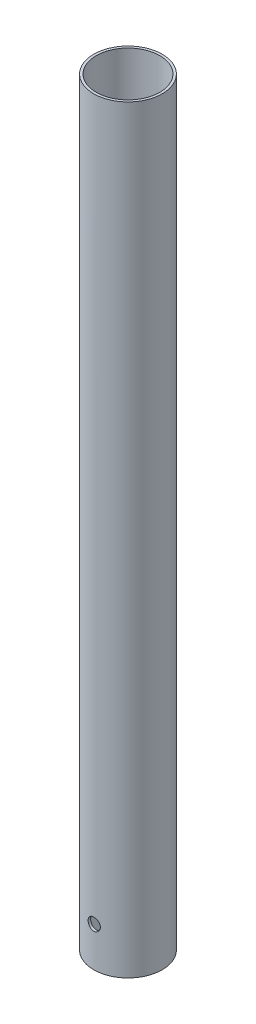
ISO-10303-21;
HEADER;
FILE_DESCRIPTION(('STEP AP214'),'2;1');
FILE_NAME('part.step','',(''),(''),'','','');
FILE_SCHEMA(('AUTOMOTIVE_DESIGN { 1 0 10303 214 1 1 1 1 }'));
ENDSEC;
DATA;
#1=APPLICATION_CONTEXT('core data for automotive mechanical design processes');
#2=APPLICATION_PROTOCOL_DEFINITION('international standard','automotive_design',2000,#1);
#3=PRODUCT_CONTEXT('',#1,'mechanical');
#4=PRODUCT('Part','Part','',(#3));
#5=PRODUCT_RELATED_PRODUCT_CATEGORY('part','',(#4));
#6=PRODUCT_DEFINITION_FORMATION('','',#4);
#7=PRODUCT_DEFINITION_CONTEXT('part definition',#1,'design');
#8=PRODUCT_DEFINITION('design','',#6,#7);
#9=PRODUCT_DEFINITION_SHAPE('','',#8);
#10=(LENGTH_UNIT() NAMED_UNIT(*) SI_UNIT(.MILLI.,.METRE.));
#11=(NAMED_UNIT(*) PLANE_ANGLE_UNIT() SI_UNIT($,.RADIAN.));
#12=(NAMED_UNIT(*) SI_UNIT($,.STERADIAN.) SOLID_ANGLE_UNIT());
#13=UNCERTAINTY_MEASURE_WITH_UNIT(LENGTH_MEASURE(1.E-05),#10,'distance_accuracy_value','');
#14=(GEOMETRIC_REPRESENTATION_CONTEXT(3) GLOBAL_UNCERTAINTY_ASSIGNED_CONTEXT((#13)) GLOBAL_UNIT_ASSIGNED_CONTEXT((#10,
#11,#12)) REPRESENTATION_CONTEXT('',''));
#15=CARTESIAN_POINT('',(0.,0.,0.));
#16=DIRECTION('',(0.,0.,1.));
#17=DIRECTION('',(1.,0.,0.));
#18=AXIS2_PLACEMENT_3D('',#15,#16,#17);
#19=CARTESIAN_POINT('',(0.,310.,0.));
#20=DIRECTION('',(0.,1.,0.));
#21=DIRECTION('',(0.,0.,1.));
#22=AXIS2_PLACEMENT_3D('',#19,#20,#21);
#23=PLANE('',#22);
#24=CARTESIAN_POINT('',(0.,310.,0.));
#25=DIRECTION('',(0.,1.,0.));
#26=DIRECTION('',(0.,0.,1.));
#27=AXIS2_PLACEMENT_3D('',#24,#25,#26);
#28=CIRCLE('',#27,14.);
#29=CARTESIAN_POINT('',(0.,310.,14.));
#30=VERTEX_POINT('',#29);
#31=EDGE_CURVE('E10',#30,#30,#28,.T.);
#32=ORIENTED_EDGE('',*,*,#31,.T.);
#33=EDGE_LOOP('',(#32));
#34=FACE_BOUND('',#33,.T.);
#35=CARTESIAN_POINT('',(0.,310.,0.));
#36=DIRECTION('',(0.,1.,0.));
#37=DIRECTION('',(0.,0.,1.));
#38=AXIS2_PLACEMENT_3D('',#35,#36,#37);
#39=CIRCLE('',#38,13.);
#40=CARTESIAN_POINT('',(0.,310.,13.));
#41=VERTEX_POINT('',#40);
#42=EDGE_CURVE('E51',#41,#41,#39,.T.);
#43=ORIENTED_EDGE('',*,*,#42,.F.);
#44=EDGE_LOOP('',(#43));
#45=FACE_BOUND('',#44,.T.);
#46=ADVANCED_FACE('F32',(#34,#45),#23,.T.);
#47=CARTESIAN_POINT('',(0.,0.,0.));
#48=DIRECTION('',(0.,1.,0.));
#49=DIRECTION('',(0.,0.,1.));
#50=AXIS2_PLACEMENT_3D('',#47,#48,#49);
#51=PLANE('',#50);
#52=CARTESIAN_POINT('',(0.,0.,0.));
#53=DIRECTION('',(0.,1.,0.));
#54=DIRECTION('',(0.,0.,1.));
#55=AXIS2_PLACEMENT_3D('',#52,#53,#54);
#56=CIRCLE('',#55,14.);
#57=CARTESIAN_POINT('',(0.,0.,14.));
#58=VERTEX_POINT('',#57);
#59=EDGE_CURVE('E46',#58,#58,#56,.T.);
#60=ORIENTED_EDGE('',*,*,#59,.F.);
#61=EDGE_LOOP('',(#60));
#62=FACE_BOUND('',#61,.T.);
#63=CARTESIAN_POINT('',(0.,0.,0.));
#64=DIRECTION('',(0.,1.,0.));
#65=DIRECTION('',(0.,0.,1.));
#66=AXIS2_PLACEMENT_3D('',#63,#64,#65);
#67=CIRCLE('',#66,13.);
#68=CARTESIAN_POINT('',(0.,0.,13.));
#69=VERTEX_POINT('',#68);
#70=EDGE_CURVE('E54',#69,#69,#67,.T.);
#71=ORIENTED_EDGE('',*,*,#70,.T.);
#72=EDGE_LOOP('',(#71));
#73=FACE_BOUND('',#72,.T.);
#74=ADVANCED_FACE('F90',(#62,#73),#51,.F.);
#75=CARTESIAN_POINT('',(0.,310.,0.));
#76=DIRECTION('',(0.,-1.,0.));
#77=DIRECTION('',(0.,0.,-1.));
#78=AXIS2_PLACEMENT_3D('',#75,#76,#77);
#79=CYLINDRICAL_SURFACE('',#78,14.);
#80=CARTESIAN_POINT('',(0.,18.67,-14.));
#81=CARTESIAN_POINT('',(-0.139239584884691,18.6699945573979,-13.9999975279519));
#82=CARTESIAN_POINT('',(-0.278551398798766,18.6583280975497,-13.9979012185717));
#83=CARTESIAN_POINT('',(-0.553257461551448,18.6119958336177,-13.9897405917584));
#84=CARTESIAN_POINT('',(-0.688648164109866,18.5773098491621,-13.9836727927304));
#85=CARTESIAN_POINT('',(-0.951498716003346,18.486027766762,-13.9682487550673));
#86=CARTESIAN_POINT('',(-1.07896532023462,18.4294506356316,-13.9588953637627));
#87=CARTESIAN_POINT('',(-1.32258294398845,18.2960443117829,-13.9379246329878));
#88=CARTESIAN_POINT('',(-1.43873504418376,18.2192170558005,-13.9263075100501));
#89=CARTESIAN_POINT('',(-1.65770744324836,18.0466007869825,-13.9019523246795));
#90=CARTESIAN_POINT('',(-1.76038642030699,17.9506338701291,-13.8892044205267));
#91=CARTESIAN_POINT('',(-1.94827611327337,17.7428452504625,-13.8640984861177));
#92=CARTESIAN_POINT('',(-2.03348564380398,17.6310224726311,-13.851740482366));
#93=CARTESIAN_POINT('',(-2.18459604528548,17.3937098828865,-13.828718102426));
#94=CARTESIAN_POINT('',(-2.2503549193704,17.268128313076,-13.8180664295287));
#95=CARTESIAN_POINT('',(-2.35978878168925,17.0074788413355,-13.799800524336));
#96=CARTESIAN_POINT('',(-2.40346549014524,16.8724116792762,-13.7921860554493));
#97=CARTESIAN_POINT('',(-2.46704527057167,16.5981311785851,-13.7809553111512));
#98=CARTESIAN_POINT('',(-2.48719373563911,16.4589764448584,-13.7772977959189));
#99=CARTESIAN_POINT('',(-2.50390640595674,16.1792170779927,-13.7742705702387));
#100=CARTESIAN_POINT('',(-2.50047252779549,16.0386125636079,-13.7749005113397));
#101=CARTESIAN_POINT('',(-2.47031736473549,15.7617111025635,-13.78033942777));
#102=CARTESIAN_POINT('',(-2.44387361595034,15.6253828097458,-13.7850985960022));
#103=CARTESIAN_POINT('',(-2.3688857538611,15.3591293635014,-13.7981816164894));
#104=CARTESIAN_POINT('',(-2.3203407810603,15.2292044593146,-13.8065056073765));
#105=CARTESIAN_POINT('',(-2.2022526779638,14.9786255211308,-13.8258332062344));
#106=CARTESIAN_POINT('',(-2.13259607876041,14.8580261183911,-13.836851230427));
#107=CARTESIAN_POINT('',(-1.97434240206301,14.6301224977845,-13.8603157063341));
#108=CARTESIAN_POINT('',(-1.88574357580469,14.5228195089008,-13.8727622898853));
#109=CARTESIAN_POINT('',(-1.69061708906587,14.3229497822127,-13.8978993100277));
#110=CARTESIAN_POINT('',(-1.58385171151662,14.2306150820204,-13.9105906924877));
#111=CARTESIAN_POINT('',(-1.35622200140276,14.065133867092,-13.934623736005));
#112=CARTESIAN_POINT('',(-1.23535755129116,13.9919875123497,-13.9459653858077));
#113=CARTESIAN_POINT('',(-0.982729125410289,13.8669309763037,-13.9660408385903));
#114=CARTESIAN_POINT('',(-0.850953766692501,13.8150433177021,-13.9747718731006));
#115=CARTESIAN_POINT('',(-0.580367401035938,13.734203117808,-13.9886206199705));
#116=CARTESIAN_POINT('',(-0.441557072364818,13.7052483699271,-13.9937386799627));
#117=CARTESIAN_POINT('',(-0.16283898538171,13.671415153955,-13.999737506353));
#118=CARTESIAN_POINT('',(-0.0229710170574315,13.666218491452,-14.0006742692249));
#119=CARTESIAN_POINT('',(0.255635962261019,13.6791977397633,-13.9983590537919));
#120=CARTESIAN_POINT('',(0.394375023096461,13.6973726130279,-13.9951072614327));
#121=CARTESIAN_POINT('',(0.66578830988004,13.7563143984903,-13.9848150834562));
#122=CARTESIAN_POINT('',(0.798498270193176,13.7969218392178,-13.9778014506051));
#123=CARTESIAN_POINT('',(1.0552266666947,13.8994046301854,-13.960768732277));
#124=CARTESIAN_POINT('',(1.17924455600831,13.9612813171688,-13.9507494579045));
#125=CARTESIAN_POINT('',(1.4164370995142,14.1052612229124,-13.9286773386827));
#126=CARTESIAN_POINT('',(1.52949072853056,14.1875607915398,-13.9166051337771));
#127=CARTESIAN_POINT('',(1.74029662989026,14.3697826510615,-13.8918196803142));
#128=CARTESIAN_POINT('',(1.8380476135904,14.4697064245934,-13.8791063778887));
#129=CARTESIAN_POINT('',(2.01666949257316,14.6857749692476,-13.8542878912599));
#130=CARTESIAN_POINT('',(2.09732417121667,14.8020997008671,-13.8421918152179));
#131=CARTESIAN_POINT('',(2.23794827077399,15.0468336894488,-13.8201546664427));
#132=CARTESIAN_POINT('',(2.29791841370413,15.1752425244028,-13.8102135184939));
#133=CARTESIAN_POINT('',(2.39515706197428,15.4399261748407,-13.7936819036385));
#134=CARTESIAN_POINT('',(2.43252842924635,15.5761622108181,-13.7870762776017));
#135=CARTESIAN_POINT('',(2.48382895891452,15.8531072951463,-13.7779274424092));
#136=CARTESIAN_POINT('',(2.49776049425864,15.9938158892447,-13.7753838220348));
#137=CARTESIAN_POINT('',(2.50171229780526,16.2735492089015,-13.7746664843416));
#138=CARTESIAN_POINT('',(2.49207328035334,16.4125690771419,-13.7764304992774));
#139=CARTESIAN_POINT('',(2.44989946243099,16.6869738180181,-13.7839923104721));
#140=CARTESIAN_POINT('',(2.4173647696137,16.8223587077421,-13.7897900877646));
#141=CARTESIAN_POINT('',(2.3304611386535,17.0854898760334,-13.8047410588042));
#142=CARTESIAN_POINT('',(2.27612576514715,17.2132475517861,-13.8138890925692));
#143=CARTESIAN_POINT('',(2.14719934056736,17.4578884394367,-13.8345140264404));
#144=CARTESIAN_POINT('',(2.07260704454505,17.5747709823784,-13.8459910696717));
#145=CARTESIAN_POINT('',(1.90408567428783,17.79605704739,-13.8701759776461));
#146=CARTESIAN_POINT('',(1.80990741155503,17.9002692317432,-13.882898459028));
#147=CARTESIAN_POINT('',(1.60540999726032,18.0915258059662,-13.9080282435319));
#148=CARTESIAN_POINT('',(1.49508713803928,18.1785662414773,-13.920435473485));
#149=CARTESIAN_POINT('',(1.26037074660264,18.3336577677888,-13.9436534678806));
#150=CARTESIAN_POINT('',(1.13587103767058,18.4015502593916,-13.9544505684285));
#151=CARTESIAN_POINT('',(0.877084840190481,18.5153492032927,-13.9730987112511));
#152=CARTESIAN_POINT('',(0.742807935956543,18.5612768614976,-13.9809525934581));
#153=CARTESIAN_POINT('',(0.506731755491748,18.6202306133961,-13.9911779735748));
#154=CARTESIAN_POINT('',(0.40633486767167,18.6388631369367,-13.9944679971863));
#155=CARTESIAN_POINT('',(0.203971552038939,18.6637496904037,-13.9988798925243));
#156=CARTESIAN_POINT('',(0.102005158109661,18.6700039871815,-14.0000018109911));
#157=CARTESIAN_POINT('',(0.,18.67,-14.));
#158=B_SPLINE_CURVE_WITH_KNOTS('',3,(#80,#81,#82,#83,#84,#85,#86,#87,#88,#89,#90,#91,#92,#93,
#94,#95,#96,#97,#98,#99,#100,#101,#102,#103,#104,#105,#106,#107,#108,#109,#110,#111,#112,#113,
#114,#115,#116,#117,#118,#119,#120,#121,#122,#123,#124,#125,#126,#127,#128,#129,#130,#131,#132,
#133,#134,#135,#136,#137,#138,#139,#140,#141,#142,#143,#144,#145,#146,#147,#148,#149,#150,#151,
#152,#153,#154,#155,#156,#157),.UNSPECIFIED.,.T.,.F.,(4,2,2,2,2,2,2,2,2,2,2,2,2,2,2,2,2,2,2,2,2,
2,2,2,2,2,2,2,2,2,2,2,2,2,2,2,2,2,4),(0.,0.41734579674163,0.835057949374027,1.25240899749005,
1.66972014433903,2.09110796789027,2.51252437496281,2.93694536469339,3.36133328652202,
3.78125426758825,4.20114112116256,4.61603258426602,5.03094018350355,5.44811857395104,
5.86533549534551,6.28850377891475,6.71167559078142,7.13529458336167,7.55887281066884,
7.97676106621614,8.39463077078321,8.80956740145243,9.22453011509511,9.64364840488131,
10.062801969859,10.4869762077788,10.9111356379343,11.3333496148672,11.7555208460958,
12.1716257235315,12.5877286444974,13.0031933708605,13.4186836366131,13.8398246877353,
14.2610626074926,14.6856934454013,15.109913492521,15.4156623340469,15.7214045841282),.UNSPECIFIED.);
#159=CARTESIAN_POINT('',(0.,18.67,-14.));
#160=VERTEX_POINT('',#159);
#161=EDGE_CURVE('E79',#160,#160,#158,.T.);
#162=ORIENTED_EDGE('',*,*,#161,.T.);
#163=EDGE_LOOP('',(#162));
#164=FACE_BOUND('',#163,.T.);
#165=CARTESIAN_POINT('',(2.5,16.17,13.7749773139559));
#166=CARTESIAN_POINT('',(2.49999454116291,16.0307803669876,13.7749799387038));
#167=CARTESIAN_POINT('',(2.48833131153942,15.8914884581297,13.7771107908789));
#168=CARTESIAN_POINT('',(2.44201304135071,15.6168237345861,13.7853946199968));
#169=CARTESIAN_POINT('',(2.40733774573406,15.4814544822435,13.7915511402329));
#170=CARTESIAN_POINT('',(2.31608691728922,15.2186493393639,13.8071672988197));
#171=CARTESIAN_POINT('',(2.25953085486463,15.0912065122701,13.8166239998033));
#172=CARTESIAN_POINT('',(2.12617418313794,14.8476289121878,13.8377715156682));
#173=CARTESIAN_POINT('',(2.04937546105772,14.7314930864297,13.8494621222548));
#174=CARTESIAN_POINT('',(1.87678833540928,14.5125030722216,13.873907770039));
#175=CARTESIAN_POINT('',(1.78081562712206,14.4097951829347,13.8866723857643));
#176=CARTESIAN_POINT('',(1.57300318552243,14.2218494710744,13.9117430255489));
#177=CARTESIAN_POINT('',(1.46116245702623,14.1366127450484,13.9240490207841));
#178=CARTESIAN_POINT('',(1.22383338523177,13.985473289733,13.9469179106052));
#179=CARTESIAN_POINT('',(1.09825637183169,13.9197077288626,13.9574682193538));
#180=CARTESIAN_POINT('',(0.837616772802054,13.8102602573145,13.9755301011882));
#181=CARTESIAN_POINT('',(0.702554895423184,13.7665766997293,13.9830419008821));
#182=CARTESIAN_POINT('',(0.428293673644163,13.7029835099548,13.9941127759412));
#183=CARTESIAN_POINT('',(0.289153116844089,13.6828275829565,13.997712773247));
#184=CARTESIAN_POINT('',(0.0094217377276731,13.6660950727537,14.0006952718093));
#185=CARTESIAN_POINT('',(-0.131168971263459,13.6695166607667,14.0000781001693));
#186=CARTESIAN_POINT('',(-0.408122988432861,13.6996517541967,13.9947279617152));
#187=CARTESIAN_POINT('',(-0.544516181052064,13.7261001235986,13.9900418473477));
#188=CARTESIAN_POINT('',(-0.810897015102343,13.8011194879108,13.9771327520065));
#189=CARTESIAN_POINT('',(-0.940884439369611,13.8496912322612,13.9689096512162));
#190=CARTESIAN_POINT('',(-1.19154151829012,13.9678359859163,13.9497715520927));
#191=CARTESIAN_POINT('',(-1.31215944836134,14.0375164220822,13.9388428375475));
#192=CARTESIAN_POINT('',(-1.54009014093527,14.1958216389388,13.9155046200703));
#193=CARTESIAN_POINT('',(-1.64740167052528,14.2844481730226,13.9030949801311));
#194=CARTESIAN_POINT('',(-1.84724240926311,14.4795951119882,13.8779680889456));
#195=CARTESIAN_POINT('',(-1.939545099914,14.5863473878378,13.8652489602259));
#196=CARTESIAN_POINT('',(-2.10496786240999,14.813939208173,13.8411025662894));
#197=CARTESIAN_POINT('',(-2.17808770266066,14.9347789227108,13.8296753166704));
#198=CARTESIAN_POINT('',(-2.30312479829604,15.1873990478973,13.8094045266784));
#199=CARTESIAN_POINT('',(-2.3550116418329,15.3191948282463,13.8005646973667));
#200=CARTESIAN_POINT('',(-2.43584403060096,15.5898258124114,13.7865283348087));
#201=CARTESIAN_POINT('',(-2.46479191631386,15.7286602965241,13.7813314298779));
#202=CARTESIAN_POINT('',(-2.49859916205466,16.0073920954412,13.7752421770154));
#203=CARTESIAN_POINT('',(-2.50378283673314,16.1472488469499,13.7742918793935));
#204=CARTESIAN_POINT('',(-2.49078161816558,16.4258303370159,13.776648684601));
#205=CARTESIAN_POINT('',(-2.47259776776007,16.564555125812,13.7799555974406));
#206=CARTESIAN_POINT('',(-2.41365525865841,16.8358845822684,13.7904004323731));
#207=CARTESIAN_POINT('',(-2.37306442666378,16.9685269026069,13.7975098617234));
#208=CARTESIAN_POINT('',(-2.27063733511702,17.225127312204,13.8147344144981));
#209=CARTESIAN_POINT('',(-2.20879963822381,17.3490848132552,13.824849741264));
#210=CARTESIAN_POINT('',(-2.06487935022985,17.5862321264677,13.847079502443));
#211=CARTESIAN_POINT('',(-1.98259057596104,17.6992949084694,13.8592138527616));
#212=CARTESIAN_POINT('',(-1.80038422344424,17.9101242551657,13.8840574336727));
#213=CARTESIAN_POINT('',(-1.70046521371052,18.0078895765671,13.896766710884));
#214=CARTESIAN_POINT('',(-1.48439134339208,18.1865483147163,13.9215130679047));
#215=CARTESIAN_POINT('',(-1.36805548621629,18.2672244196152,13.9335402120035));
#216=CARTESIAN_POINT('',(-1.12329296566844,18.4078860624221,13.9554035273845));
#217=CARTESIAN_POINT('',(-0.994866736508675,18.4678723430216,13.9652397773074));
#218=CARTESIAN_POINT('',(-0.730189348324159,18.5651205185574,13.9815700956849));
#219=CARTESIAN_POINT('',(-0.593979571421845,18.6024922165785,13.9880802890981));
#220=CARTESIAN_POINT('',(-0.317090343286913,18.65380228348,13.9970934930076));
#221=CARTESIAN_POINT('',(-0.176411318075573,18.6677428790906,13.9995968842815));
#222=CARTESIAN_POINT('',(0.103333169371392,18.6717234269469,14.0003078168069));
#223=CARTESIAN_POINT('',(0.242393904292869,18.6620926511361,13.9985745411226));
#224=CARTESIAN_POINT('',(0.516882556055424,18.6199210332612,13.9911289095657));
#225=CARTESIAN_POINT('',(0.65231050098277,18.5873803683739,13.9854165844658));
#226=CARTESIAN_POINT('',(0.915536497496653,18.500446063029,13.9706535216891));
#227=CARTESIAN_POINT('',(1.04334539246558,18.4460843742723,13.9616076667541));
#228=CARTESIAN_POINT('',(1.28807790386464,18.3170893068895,13.9411603934573));
#229=CARTESIAN_POINT('',(1.40500088290236,18.2424547422466,13.9297588372901));
#230=CARTESIAN_POINT('',(1.6262914777391,18.0738840112873,13.9056730650892));
#231=CARTESIAN_POINT('',(1.73047516435831,17.979708481173,13.892974041367));
#232=CARTESIAN_POINT('',(1.92167550896122,17.7752286280359,13.8678219751628));
#233=CARTESIAN_POINT('',(2.00868813488379,17.6649205273697,13.8553689910715));
#234=CARTESIAN_POINT('',(2.1637462241578,17.4302188388162,13.8320070537405));
#235=CARTESIAN_POINT('',(2.23162894316816,17.3057163473804,13.8211117157455));
#236=CARTESIAN_POINT('',(2.34540886935923,17.0469249323444,13.8022610834653));
#237=CARTESIAN_POINT('',(2.39132736832844,16.9126456323623,13.7943029436204));
#238=CARTESIAN_POINT('',(2.45025798781186,16.6765932647866,13.7839341813702));
#239=CARTESIAN_POINT('',(2.46888019081668,16.5762241340885,13.7805947327216));
#240=CARTESIAN_POINT('',(2.49375305438023,16.3739162380321,13.7761153629215));
#241=CARTESIAN_POINT('',(2.50000399856396,16.2719775087126,13.7749753913445));
#242=CARTESIAN_POINT('',(2.5,16.17,13.7749773139559));
#243=B_SPLINE_CURVE_WITH_KNOTS('',3,(#165,#166,#167,#168,#169,#170,#171,#172,#173,#174,#175,
#176,#177,#178,#179,#180,#181,#182,#183,#184,#185,#186,#187,#188,#189,#190,#191,#192,#193,#194,
#195,#196,#197,#198,#199,#200,#201,#202,#203,#204,#205,#206,#207,#208,#209,#210,#211,#212,#213,
#214,#215,#216,#217,#218,#219,#220,#221,#222,#223,#224,#225,#226,#227,#228,#229,#230,#231,#232,
#233,#234,#235,#236,#237,#238,#239,#240,#241,#242),.UNSPECIFIED.,.T.,.F.,(4,2,2,2,2,2,2,2,2,2,2,
2,2,2,2,2,2,2,2,2,2,2,2,2,2,2,2,2,2,2,2,2,2,2,2,2,2,2,4),(0.,0.417285836009319,
0.834939451951072,1.25222227420764,1.66946620696475,2.09093251520215,2.512425267948,
2.93682027279778,3.36118362098868,3.78106358503935,4.20091098159995,4.61598714610604,
5.03107737256277,5.44831662439174,5.86559450693788,6.28867984623349,6.71177029320069,
7.13546462585336,7.55911572303873,7.97696761802826,8.39480086586731,8.80954621973386,
9.22431963646754,9.64345757488935,10.0626295608599,10.4868484189542,10.9110520475065,
11.3331791121111,11.7552660584073,12.171490547398,12.5877118174953,13.0033258408441,
13.4189641839515,13.8400311188066,14.2611968100938,14.6858441972248,15.1100790990291,
15.4157453666601,15.7214046264678),.UNSPECIFIED.);
#244=CARTESIAN_POINT('',(2.5,16.17,13.7749773139559));
#245=VERTEX_POINT('',#244);
#246=EDGE_CURVE('E74',#245,#245,#243,.T.);
#247=ORIENTED_EDGE('',*,*,#246,.T.);
#248=EDGE_LOOP('',(#247));
#249=FACE_BOUND('',#248,.T.);
#250=ORIENTED_EDGE('',*,*,#31,.F.);
#251=EDGE_LOOP('',(#250));
#252=FACE_BOUND('',#251,.T.);
#253=ORIENTED_EDGE('',*,*,#59,.T.);
#254=EDGE_LOOP('',(#253));
#255=FACE_BOUND('',#254,.T.);
#256=ADVANCED_FACE('F34',(#164,#249,#252,#255),#79,.T.);
#257=CARTESIAN_POINT('',(0.,310.,0.));
#258=DIRECTION('',(0.,-1.,0.));
#259=DIRECTION('',(0.,0.,-1.));
#260=AXIS2_PLACEMENT_3D('',#257,#258,#259);
#261=CYLINDRICAL_SURFACE('',#260,13.);
#262=CARTESIAN_POINT('',(0.,18.67,-13.));
#263=CARTESIAN_POINT('',(-0.139052660180753,18.6699947587803,-12.9999974610984));
#264=CARTESIAN_POINT('',(-0.278172773072153,18.658359412702,-12.9977459806996));
#265=CARTESIAN_POINT('',(-0.552488133091359,18.6121580551378,-12.9889814495606));
#266=CARTESIAN_POINT('',(-0.687680044894598,18.577573119314,-12.9824648818705));
#267=CARTESIAN_POINT('',(-0.950132537462372,18.4865744195119,-12.9658986493339));
#268=CARTESIAN_POINT('',(-1.07740031971373,18.4301808217264,-12.9558522492613));
#269=CARTESIAN_POINT('',(-1.32065723842358,18.2972238720737,-12.9333215487838));
#270=CARTESIAN_POINT('',(-1.43664719548844,18.2206619892138,-12.9208374259537));
#271=CARTESIAN_POINT('',(-1.65552432974222,18.0485208342922,-12.8946323002435));
#272=CARTESIAN_POINT('',(-1.75824929536754,17.9527371685489,-12.8808989548617));
#273=CARTESIAN_POINT('',(-1.94627668615617,17.7453109628053,-12.8538341361733));
#274=CARTESIAN_POINT('',(-2.03157781945352,17.6336672479234,-12.8405026927278));
#275=CARTESIAN_POINT('',(-2.18301679620621,17.3965360046422,-12.8156309401952));
#276=CARTESIAN_POINT('',(-2.24898851450226,17.2709405688997,-12.8041065326509));
#277=CARTESIAN_POINT('',(-2.35883220315187,17.0101900899734,-12.7843281256073));
#278=CARTESIAN_POINT('',(-2.40270618335278,16.8750359174576,-12.7760738286974));
#279=CARTESIAN_POINT('',(-2.46658610457138,16.6007438082808,-12.7638947012764));
#280=CARTESIAN_POINT('',(-2.48687558791542,16.4616742333029,-12.7599184822057));
#281=CARTESIAN_POINT('',(-2.50389090184761,16.18205236308,-12.7565908775945));
#282=CARTESIAN_POINT('',(-2.50061895687192,16.0415002090564,-12.7572390554642));
#283=CARTESIAN_POINT('',(-2.47083395608553,15.7649647768379,-12.763040258418));
#284=CARTESIAN_POINT('',(-2.44464430650053,15.6289451552352,-12.7681305946622));
#285=CARTESIAN_POINT('',(-2.37027708135777,15.3632670168844,-12.7821440039021));
#286=CARTESIAN_POINT('',(-2.32209852760331,15.2336087834127,-12.7910672474073));
#287=CARTESIAN_POINT('',(-2.20480765459312,14.9833930561805,-12.8118060352358));
#288=CARTESIAN_POINT('',(-2.13556565597228,14.862897889492,-12.8236394070727));
#289=CARTESIAN_POINT('',(-1.97820505089348,14.6351150288614,-12.848853471063));
#290=CARTESIAN_POINT('',(-1.89008443268647,14.5278287444083,-12.8622343280499));
#291=CARTESIAN_POINT('',(-1.69572891132668,14.3276414657792,-12.889308238097));
#292=CARTESIAN_POINT('',(-1.58921761155993,14.2350088099632,-12.9030027865394));
#293=CARTESIAN_POINT('',(-1.36202665615399,14.0688844926995,-12.9289572102898));
#294=CARTESIAN_POINT('',(-1.24134684412448,13.9953930425589,-12.9412170697587));
#295=CARTESIAN_POINT('',(-0.988957762488794,13.8695939529603,-12.9629474861032));
#296=CARTESIAN_POINT('',(-0.857233713043068,13.8173152653828,-12.9724142260635));
#297=CARTESIAN_POINT('',(-0.586650569197115,13.7357025766531,-12.9874624721642));
#298=CARTESIAN_POINT('',(-0.447792274642339,13.7063660093348,-12.993044412827));
#299=CARTESIAN_POINT('',(-0.169189915144617,13.6718462338464,-12.9996341283048));
#300=CARTESIAN_POINT('',(-0.0294929779953189,13.666295528159,-13.0007114935454));
#301=CARTESIAN_POINT('',(0.248832636592824,13.6785177771966,-12.9983632998844));
#302=CARTESIAN_POINT('',(0.387461368986751,13.6962895239023,-12.994937974206));
#303=CARTESIAN_POINT('',(0.658542242580222,13.754346743995,-12.9840126871957));
#304=CARTESIAN_POINT('',(0.791035903724994,13.7944452784258,-12.976546573136));
#305=CARTESIAN_POINT('',(1.0474195560019,13.8958147801244,-12.9583735448858));
#306=CARTESIAN_POINT('',(1.1713089389197,13.9570872422973,-12.9476664018813));
#307=CARTESIAN_POINT('',(1.40852868267246,14.0998717431747,-12.924025465347));
#308=CARTESIAN_POINT('',(1.52172218526331,14.1816070915368,-12.9110676225358));
#309=CARTESIAN_POINT('',(1.73291860543103,14.3626962234974,-12.8844225517876));
#310=CARTESIAN_POINT('',(1.83092002380893,14.462051743834,-12.8707352520445));
#311=CARTESIAN_POINT('',(2.01035510164863,14.677228161396,-12.8439416383922));
#312=CARTESIAN_POINT('',(2.09153739238512,14.793260250283,-12.8308461515727));
#313=CARTESIAN_POINT('',(2.23325948833317,15.0375303242733,-12.8069410375943));
#314=CARTESIAN_POINT('',(2.29380008432373,15.1657678415486,-12.796131322874));
#315=CARTESIAN_POINT('',(2.39216884187718,15.4301863589462,-12.7781075731774));
#316=CARTESIAN_POINT('',(2.43010977595278,15.5663241334675,-12.770875715852));
#317=CARTESIAN_POINT('',(2.48254790543446,15.8431950732065,-12.7607868732141));
#318=CARTESIAN_POINT('',(2.49704789991888,15.9839276877074,-12.7579293655635));
#319=CARTESIAN_POINT('',(2.50209511687348,16.2634733559216,-12.7569402050647));
#320=CARTESIAN_POINT('',(2.49303910212207,16.4022791229674,-12.7587302704385));
#321=CARTESIAN_POINT('',(2.45210266538041,16.6763499445064,-12.7666604796616));
#322=CARTESIAN_POINT('',(2.42022239691185,16.8116150228088,-12.7728005942514));
#323=CARTESIAN_POINT('',(2.33471347717499,17.074536619842,-12.7887053259627));
#324=CARTESIAN_POINT('',(2.28112994200388,17.2022082959176,-12.7984624206699));
#325=CARTESIAN_POINT('',(2.15377970785528,17.4468123618909,-12.8205066533974));
#326=CARTESIAN_POINT('',(2.08001148134918,17.5637439381089,-12.8327939828824));
#327=CARTESIAN_POINT('',(1.91301563814429,17.7855315746846,-12.8587559030274));
#328=CARTESIAN_POINT('',(1.81950009853846,17.8901686814821,-12.8724492796511));
#329=CARTESIAN_POINT('',(1.61626238485009,18.0823973754943,-12.8995420316146));
#330=CARTESIAN_POINT('',(1.50653649326075,18.1699850420681,-12.9129413387038));
#331=CARTESIAN_POINT('',(1.27273625734664,18.3264130168556,-12.9380865705891));
#332=CARTESIAN_POINT('',(1.14853493486942,18.3950663700691,-12.9498154901243));
#333=CARTESIAN_POINT('',(0.890172259350419,18.5104207923641,-12.9701319076699));
#334=CARTESIAN_POINT('',(0.75602025329486,18.5571421678689,-12.9787223099363));
#335=CARTESIAN_POINT('',(0.517923565705546,18.6179845842146,-12.9900734375022));
#336=CARTESIAN_POINT('',(0.415357439701676,18.6374564897523,-12.9937745900334));
#337=CARTESIAN_POINT('',(0.208540158514684,18.663465983637,-12.9987387895389));
#338=CARTESIAN_POINT('',(0.104289050170327,18.670003930898,-13.0000019041681));
#339=CARTESIAN_POINT('',(0.,18.67,-13.));
#340=B_SPLINE_CURVE_WITH_KNOTS('',3,(#262,#263,#264,#265,#266,#267,#268,#269,#270,#271,#272,
#273,#274,#275,#276,#277,#278,#279,#280,#281,#282,#283,#284,#285,#286,#287,#288,#289,#290,#291,
#292,#293,#294,#295,#296,#297,#298,#299,#300,#301,#302,#303,#304,#305,#306,#307,#308,#309,#310,
#311,#312,#313,#314,#315,#316,#317,#318,#319,#320,#321,#322,#323,#324,#325,#326,#327,#328,#329,
#330,#331,#332,#333,#334,#335,#336,#337,#338,#339),.UNSPECIFIED.,.T.,.F.,(4,2,2,2,2,2,2,2,2,2,2,
2,2,2,2,2,2,2,2,2,2,2,2,2,2,2,2,2,2,2,2,2,2,2,2,2,2,2,4),(0.,0.41677654057257,0.833897184796517,
1.25063304157329,1.66733855274582,2.08873532404099,2.51016332788524,2.93511361824241,
3.36002525127148,3.77977378984828,4.19948270045458,4.61336264699441,5.02726100716069,
5.44376099870307,5.86030539553681,6.28376393575653,6.70722715049957,7.13126639340044,
7.5552581990633,7.9726750569953,8.3900702950831,8.80402218494166,9.21800330627654,
9.63671570954055,10.0554694062924,10.480090247665,10.9046948200739,11.3271624654498,
11.7495796603136,12.1649281712355,12.5802738884444,12.9947605928499,13.4092786732858,
13.8303190431965,14.2514561202698,14.6766136027338,15.1013766593073,15.4139664054683,
15.7265474772226),.UNSPECIFIED.);
#341=CARTESIAN_POINT('',(0.,18.67,-13.));
#342=VERTEX_POINT('',#341);
#343=EDGE_CURVE('E37',#342,#342,#340,.T.);
#344=ORIENTED_EDGE('',*,*,#343,.F.);
#345=EDGE_LOOP('',(#344));
#346=FACE_BOUND('',#345,.T.);
#347=CARTESIAN_POINT('',(2.5,16.17,12.7573508221731));
#348=CARTESIAN_POINT('',(2.49999473771111,16.0309741402386,12.7573535445971));
#349=CARTESIAN_POINT('',(2.48836372459743,15.8918807698169,12.759648106677));
#350=CARTESIAN_POINT('',(2.44218113719486,15.6176209411147,12.7685662321878));
#351=CARTESIAN_POINT('',(2.40761053611891,15.4824578399415,12.7751933891363));
#352=CARTESIAN_POINT('',(2.31665374663638,15.2200663552577,12.7919990068767));
#353=CARTESIAN_POINT('',(2.26028839852833,15.0928305261755,12.8021740742201));
#354=CARTESIAN_POINT('',(2.12739803553043,14.8496274500609,12.8249250156472));
#355=CARTESIAN_POINT('',(2.05087442406184,14.7336594193318,12.8375007225812));
#356=CARTESIAN_POINT('',(1.87877245822431,14.5147587875637,12.8638197867113));
#357=CARTESIAN_POINT('',(1.78298111863696,14.4119950504917,12.8775751102276));
#358=CARTESIAN_POINT('',(1.57552312258059,14.2238924698524,12.90459798027));
#359=CARTESIAN_POINT('',(1.46385539849171,14.1385547990555,12.9178654939172));
#360=CARTESIAN_POINT('',(1.22670187107625,13.9870765897423,12.9425463769484));
#361=CARTESIAN_POINT('',(1.10111228887016,13.921095741295,12.9539439985905));
#362=CARTESIAN_POINT('',(0.840374478610752,13.8112335746728,12.9734667695503));
#363=CARTESIAN_POINT('',(0.705227078537795,13.7673503448802,12.9815922019259));
#364=CARTESIAN_POINT('',(0.430960845173449,13.7034525964944,12.9935705508999));
#365=CARTESIAN_POINT('',(0.291910638125102,13.6831532248799,12.9974744160998));
#366=CARTESIAN_POINT('',(0.0123270709409618,13.6661114167779,13.0007455117712));
#367=CARTESIAN_POINT('',(-0.12820615550251,13.669366874664,13.000113147748));
#368=CARTESIAN_POINT('',(-0.40481158028986,13.6991247626059,12.9944227232998));
#369=CARTESIAN_POINT('',(-0.54091815608966,13.7253204331309,12.9894230651197));
#370=CARTESIAN_POINT('',(-0.8067670496537,13.7997294543125,12.9756254537905));
#371=CARTESIAN_POINT('',(-0.936509126506346,13.8479436377117,12.9668273569848));
#372=CARTESIAN_POINT('',(-1.18683036724386,13.9653102821441,12.9463243258099));
#373=CARTESIAN_POINT('',(-1.30735103519341,14.034584445285,12.9346025687447));
#374=CARTESIAN_POINT('',(-1.53517146817959,14.1920147939395,12.9095469786329));
#375=CARTESIAN_POINT('',(-1.64246981980512,14.2801729953257,12.8962129735448));
#376=CARTESIAN_POINT('',(-1.84261846944045,14.4745565091686,12.8691545349335));
#377=CARTESIAN_POINT('',(-1.93520788986346,14.581050234235,12.855427272809));
#378=CARTESIAN_POINT('',(-2.10125316353158,14.8081901746724,12.8293343997587));
#379=CARTESIAN_POINT('',(-2.17470870723888,14.9288366189529,12.8169688108631));
#380=CARTESIAN_POINT('',(-2.30048133251874,15.1812140172712,12.7949946866484));
#381=CARTESIAN_POINT('',(-2.35275887460557,15.3129651551236,12.785391318016));
#382=CARTESIAN_POINT('',(-2.43436110074129,15.5836075543789,12.7701067672006));
#383=CARTESIAN_POINT('',(-2.4636885318979,15.7224979590964,12.7644251156011));
#384=CARTESIAN_POINT('',(-2.49817375220936,16.0011193246285,12.7577206137951));
#385=CARTESIAN_POINT('',(-2.50370706985663,16.1408021136838,12.7566253860666));
#386=CARTESIAN_POINT('',(-2.49145509963841,16.4190953638697,12.759023830842));
#387=CARTESIAN_POINT('',(-2.4736710284025,16.5577058805686,12.7625172639236));
#388=CARTESIAN_POINT('',(-2.41561200598846,16.8286749431925,12.7736318530023));
#389=CARTESIAN_POINT('',(-2.37553534674613,16.9610776041666,12.7812165991315));
#390=CARTESIAN_POINT('',(-2.27423978654129,17.2172888474545,12.7996276252393));
#391=CARTESIAN_POINT('',(-2.21301925736502,17.3410967670358,12.8104541548475));
#392=CARTESIAN_POINT('',(-2.07031485911768,17.578254242385,12.8342928537119));
#393=CARTESIAN_POINT('',(-1.98859461228271,17.6914590144377,12.8473298999345));
#394=CARTESIAN_POINT('',(-1.80752787788233,17.902685118866,12.8740513624295));
#395=CARTESIAN_POINT('',(-1.70817971928818,18.0007050101472,12.8877358399847));
#396=CARTESIAN_POINT('',(-1.49299681253014,18.1801897520335,12.9144437282901));
#397=CARTESIAN_POINT('',(-1.37694924353664,18.2614015320574,12.9274550888692));
#398=CARTESIAN_POINT('',(-1.13263940226607,18.4031753060949,12.951145430407));
#399=CARTESIAN_POINT('',(-1.00437761723896,18.4637381233967,12.9618245043496));
#400=CARTESIAN_POINT('',(-0.739966613700503,18.5621197298356,12.9795953468859));
#401=CARTESIAN_POINT('',(-0.603864248412592,18.6000608106462,12.9867063704086));
#402=CARTESIAN_POINT('',(-0.327068775042131,18.6525111946202,12.9966222021743));
#403=CARTESIAN_POINT('',(-0.186376178041924,18.6670230973968,12.9994274881639));
#404=CARTESIAN_POINT('',(0.0931827521181688,18.6721088314925,13.0004055871504));
#405=CARTESIAN_POINT('',(0.232042028620338,18.6630642223302,12.9986522399737));
#406=CARTESIAN_POINT('',(0.506222907249129,18.6221319198343,12.9908642019523));
#407=CARTESIAN_POINT('',(0.64154454714222,18.5902444704656,12.9848295568325));
#408=CARTESIAN_POINT('',(0.904593549254301,18.5046958076119,12.9691577474469));
#409=CARTESIAN_POINT('',(1.03233521137864,18.4510771916485,12.9595276339264));
#410=CARTESIAN_POINT('',(1.27706488245869,18.3236348854929,12.9377052532993));
#411=CARTESIAN_POINT('',(1.39405212054941,18.2498097484262,12.9255128027329));
#412=CARTESIAN_POINT('',(1.61584795767644,18.0827465496702,12.8996784805017));
#413=CARTESIAN_POINT('',(1.72044748489624,17.9892338279224,12.8860176059801));
#414=CARTESIAN_POINT('',(1.91260166612257,17.7860178174388,12.8589033276349));
#415=CARTESIAN_POINT('',(2.00015229635294,17.6763107173201,12.8454499734772));
#416=CARTESIAN_POINT('',(2.15653452422156,17.4425301610452,12.8201292259648));
#417=CARTESIAN_POINT('',(2.22517391596927,17.318326241084,12.8082786988589));
#418=CARTESIAN_POINT('',(2.340501544276,17.0599592262486,12.7877094152025));
#419=CARTESIAN_POINT('',(2.3872101977801,16.9258055296597,12.7789877475578));
#420=CARTESIAN_POINT('',(2.4480213622143,16.6877416252547,12.7674530961672));
#421=CARTESIAN_POINT('',(2.46747939479382,16.5852120123956,12.7636876084207));
#422=CARTESIAN_POINT('',(2.49347049397996,16.3784675536626,12.7586354876446));
#423=CARTESIAN_POINT('',(2.50000394608695,16.2742527581459,12.7573487806808));
#424=CARTESIAN_POINT('',(2.5,16.17,12.7573508221731));
#425=B_SPLINE_CURVE_WITH_KNOTS('',3,(#347,#348,#349,#350,#351,#352,#353,#354,#355,#356,#357,
#358,#359,#360,#361,#362,#363,#364,#365,#366,#367,#368,#369,#370,#371,#372,#373,#374,#375,#376,
#377,#378,#379,#380,#381,#382,#383,#384,#385,#386,#387,#388,#389,#390,#391,#392,#393,#394,#395,
#396,#397,#398,#399,#400,#401,#402,#403,#404,#405,#406,#407,#408,#409,#410,#411,#412,#413,#414,
#415,#416,#417,#418,#419,#420,#421,#422,#423,#424),.UNSPECIFIED.,.T.,.F.,(4,2,2,2,2,2,2,2,2,2,2,
2,2,2,2,2,2,2,2,2,2,2,2,2,2,2,2,2,2,2,2,2,2,2,2,2,2,2,4),(0.,0.416695988880008,
0.833738030737637,1.25038227614466,1.66699752238094,2.08849971831381,2.5100302719089,
2.93494642182602,3.35982580683554,3.77951819081206,4.19917305788035,4.61330049028081,
5.02744358632398,5.44402696725573,5.8606548406758,6.28400091938149,6.70735384633275,
7.13149357344848,7.55558252364952,7.97295317898353,8.39030205806815,8.80399666093121,
9.21772312804067,9.63645909210582,10.0552347712562,10.4799185943274,10.9045854829869,
11.32693532976,11.7492383109661,12.1647436860036,12.5802446234503,12.9949350033565,
13.4096550846627,13.8305978202814,14.251639784134,14.6768151908599,15.1015939816585,
15.4140754294552,15.7265475567531),.UNSPECIFIED.);
#426=CARTESIAN_POINT('',(2.5,16.17,12.7573508221731));
#427=VERTEX_POINT('',#426);
#428=EDGE_CURVE('E56',#427,#427,#425,.T.);
#429=ORIENTED_EDGE('',*,*,#428,.F.);
#430=EDGE_LOOP('',(#429));
#431=FACE_BOUND('',#430,.T.);
#432=ORIENTED_EDGE('',*,*,#42,.T.);
#433=EDGE_LOOP('',(#432));
#434=FACE_BOUND('',#433,.T.);
#435=ORIENTED_EDGE('',*,*,#70,.F.);
#436=EDGE_LOOP('',(#435));
#437=FACE_BOUND('',#436,.T.);
#438=ADVANCED_FACE('F61',(#346,#431,#434,#437),#261,.F.);
#439=CARTESIAN_POINT('',(0.,16.17,-14.));
#440=DIRECTION('',(0.,0.,1.));
#441=DIRECTION('',(1.,0.,0.));
#442=AXIS2_PLACEMENT_3D('',#439,#440,#441);
#443=CYLINDRICAL_SURFACE('',#442,2.5);
#444=ORIENTED_EDGE('',*,*,#428,.T.);
#445=EDGE_LOOP('',(#444));
#446=FACE_BOUND('',#445,.T.);
#447=ORIENTED_EDGE('',*,*,#246,.F.);
#448=EDGE_LOOP('',(#447));
#449=FACE_BOUND('',#448,.T.);
#450=ADVANCED_FACE('F67',(#446,#449),#443,.F.);
#451=ORIENTED_EDGE('',*,*,#343,.T.);
#452=EDGE_LOOP('',(#451));
#453=FACE_BOUND('',#452,.T.);
#454=ORIENTED_EDGE('',*,*,#161,.F.);
#455=EDGE_LOOP('',(#454));
#456=FACE_BOUND('',#455,.T.);
#457=ADVANCED_FACE('F64',(#453,#456),#443,.F.);
#458=CLOSED_SHELL('',(#46,#74,#256,#438,#450,#457));
#459=MANIFOLD_SOLID_BREP('B2',#458);
#460=ADVANCED_BREP_SHAPE_REPRESENTATION('',(#18,#459),#14);
#461=SHAPE_DEFINITION_REPRESENTATION(#9,#460);
ENDSEC;
END-ISO-10303-21;
